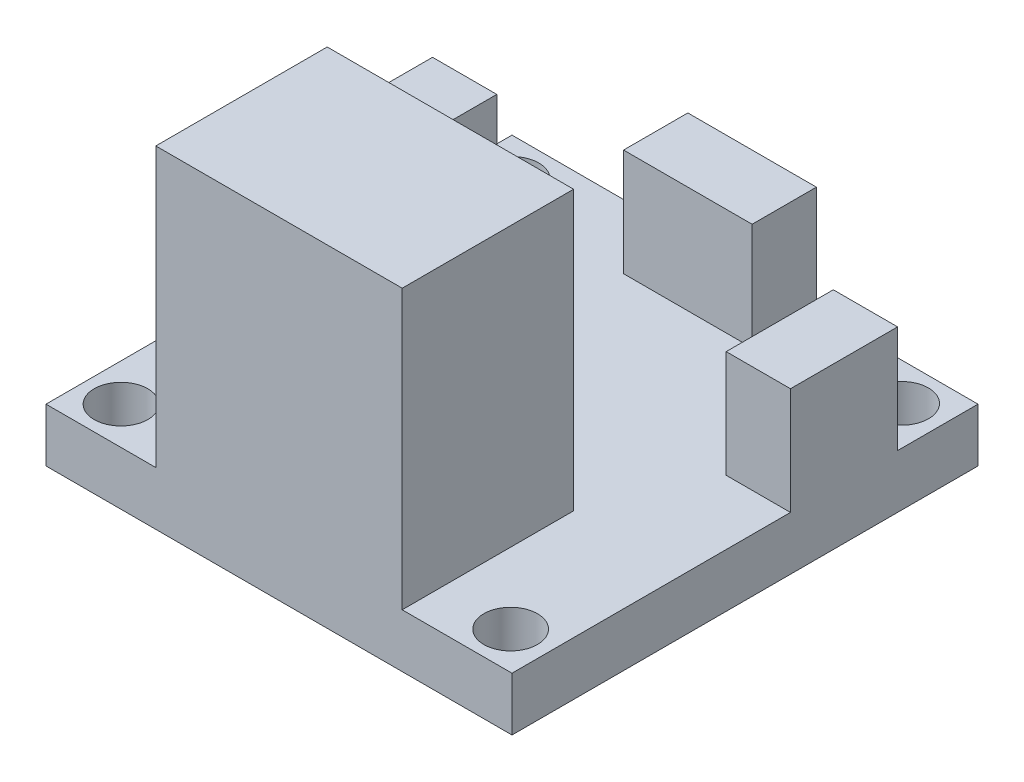
ISO-10303-21;
HEADER;
FILE_DESCRIPTION(('STEP AP214'),'2;1');
FILE_NAME('part.step','',(''),(''),'','','');
FILE_SCHEMA(('AUTOMOTIVE_DESIGN { 1 0 10303 214 1 1 1 1 }'));
ENDSEC;
DATA;
#1=APPLICATION_CONTEXT('core data for automotive mechanical design processes');
#2=APPLICATION_PROTOCOL_DEFINITION('international standard','automotive_design',2000,#1);
#3=PRODUCT_CONTEXT('',#1,'mechanical');
#4=PRODUCT('Part','Part','',(#3));
#5=PRODUCT_RELATED_PRODUCT_CATEGORY('part','',(#4));
#6=PRODUCT_DEFINITION_FORMATION('','',#4);
#7=PRODUCT_DEFINITION_CONTEXT('part definition',#1,'design');
#8=PRODUCT_DEFINITION('design','',#6,#7);
#9=PRODUCT_DEFINITION_SHAPE('','',#8);
#10=(LENGTH_UNIT() NAMED_UNIT(*) SI_UNIT(.MILLI.,.METRE.));
#11=(NAMED_UNIT(*) PLANE_ANGLE_UNIT() SI_UNIT($,.RADIAN.));
#12=(NAMED_UNIT(*) SI_UNIT($,.STERADIAN.) SOLID_ANGLE_UNIT());
#13=UNCERTAINTY_MEASURE_WITH_UNIT(LENGTH_MEASURE(1.E-05),#10,'distance_accuracy_value','');
#14=(GEOMETRIC_REPRESENTATION_CONTEXT(3) GLOBAL_UNCERTAINTY_ASSIGNED_CONTEXT((#13)) GLOBAL_UNIT_ASSIGNED_CONTEXT((#10,
#11,#12)) REPRESENTATION_CONTEXT('',''));
#15=CARTESIAN_POINT('',(0.,0.,0.));
#16=DIRECTION('',(0.,0.,1.));
#17=DIRECTION('',(1.,0.,0.));
#18=AXIS2_PLACEMENT_3D('',#15,#16,#17);
#19=CARTESIAN_POINT('',(0.,5.,0.));
#20=DIRECTION('',(0.,1.,0.));
#21=DIRECTION('',(0.,0.,1.));
#22=AXIS2_PLACEMENT_3D('',#19,#20,#21);
#23=PLANE('',#22);
#24=CARTESIAN_POINT('',(-18.25,5.,18.25));
#25=DIRECTION('',(0.,1.,0.));
#26=DIRECTION('',(0.,0.,1.));
#27=AXIS2_PLACEMENT_3D('',#24,#25,#26);
#28=CIRCLE('',#27,2.5);
#29=CARTESIAN_POINT('',(-18.25,5.,20.75));
#30=VERTEX_POINT('',#29);
#31=EDGE_CURVE('E377',#30,#30,#28,.T.);
#32=ORIENTED_EDGE('',*,*,#31,.F.);
#33=EDGE_LOOP('',(#32));
#34=FACE_BOUND('',#33,.T.);
#35=CARTESIAN_POINT('',(18.1240313628791,5.,18.25));
#36=DIRECTION('',(0.,1.,0.));
#37=DIRECTION('',(0.,0.,1.));
#38=AXIS2_PLACEMENT_3D('',#35,#36,#37);
#39=CIRCLE('',#38,2.5);
#40=CARTESIAN_POINT('',(18.1240313628791,5.,20.75));
#41=VERTEX_POINT('',#40);
#42=EDGE_CURVE('E371',#41,#41,#39,.T.);
#43=ORIENTED_EDGE('',*,*,#42,.F.);
#44=EDGE_LOOP('',(#43));
#45=FACE_BOUND('',#44,.T.);
#46=CARTESIAN_POINT('',(18.1240313628791,5.,-18.25));
#47=DIRECTION('',(0.,1.,0.));
#48=DIRECTION('',(0.,0.,1.));
#49=AXIS2_PLACEMENT_3D('',#46,#47,#48);
#50=CIRCLE('',#49,2.5);
#51=CARTESIAN_POINT('',(18.1240313628791,5.,-15.75));
#52=VERTEX_POINT('',#51);
#53=EDGE_CURVE('E365',#52,#52,#50,.T.);
#54=ORIENTED_EDGE('',*,*,#53,.F.);
#55=EDGE_LOOP('',(#54));
#56=FACE_BOUND('',#55,.T.);
#57=CARTESIAN_POINT('',(-18.25,5.,-18.25));
#58=DIRECTION('',(0.,1.,0.));
#59=DIRECTION('',(0.,0.,1.));
#60=AXIS2_PLACEMENT_3D('',#57,#58,#59);
#61=CIRCLE('',#60,2.5);
#62=CARTESIAN_POINT('',(-18.25,5.,-15.75));
#63=VERTEX_POINT('',#62);
#64=EDGE_CURVE('E359',#63,#63,#61,.T.);
#65=ORIENTED_EDGE('',*,*,#64,.F.);
#66=EDGE_LOOP('',(#65));
#67=FACE_BOUND('',#66,.T.);
#68=DIRECTION('',(0.,0.,1.));
#69=VECTOR('',#68,1.);
#70=CARTESIAN_POINT('',(15.75,5.,-14.2434558567143));
#71=LINE('',#70,#69);
#72=CARTESIAN_POINT('',(15.75,5.,-14.2434558567143));
#73=VERTEX_POINT('',#72);
#74=CARTESIAN_POINT('',(15.75,5.,-4.2434558567143));
#75=VERTEX_POINT('',#74);
#76=EDGE_CURVE('E51',#73,#75,#71,.T.);
#77=ORIENTED_EDGE('',*,*,#76,.F.);
#78=DIRECTION('',(-1.,0.,0.));
#79=VECTOR('',#78,1.);
#80=CARTESIAN_POINT('',(21.75,5.,-14.2434558567143));
#81=LINE('',#80,#79);
#82=CARTESIAN_POINT('',(21.75,5.,-14.2434558567143));
#83=VERTEX_POINT('',#82);
#84=EDGE_CURVE('E355',#83,#73,#81,.T.);
#85=ORIENTED_EDGE('',*,*,#84,.F.);
#86=DIRECTION('',(0.,0.,-1.));
#87=VECTOR('',#86,1.);
#88=CARTESIAN_POINT('',(21.75,5.,-21.75));
#89=LINE('',#88,#87);
#90=CARTESIAN_POINT('',(21.75,5.,-21.75));
#91=VERTEX_POINT('',#90);
#92=EDGE_CURVE('E194',#83,#91,#89,.T.);
#93=ORIENTED_EDGE('',*,*,#92,.T.);
#94=DIRECTION('',(-1.,0.,0.));
#95=VECTOR('',#94,1.);
#96=CARTESIAN_POINT('',(-21.75,5.,-21.75));
#97=LINE('',#96,#95);
#98=CARTESIAN_POINT('',(6.66419904438874,5.,-21.75));
#99=VERTEX_POINT('',#98);
#100=EDGE_CURVE('E280',#91,#99,#97,.T.);
#101=ORIENTED_EDGE('',*,*,#100,.T.);
#102=DIRECTION('',(0.,0.,-1.));
#103=VECTOR('',#102,1.);
#104=CARTESIAN_POINT('',(6.66419904438874,5.,-21.75));
#105=LINE('',#104,#103);
#106=CARTESIAN_POINT('',(6.66419904438874,5.,-15.75));
#107=VERTEX_POINT('',#106);
#108=EDGE_CURVE('E208',#107,#99,#105,.T.);
#109=ORIENTED_EDGE('',*,*,#108,.F.);
#110=DIRECTION('',(1.,0.,0.));
#111=VECTOR('',#110,1.);
#112=CARTESIAN_POINT('',(-5.33580095561126,5.,-15.75));
#113=LINE('',#112,#111);
#114=CARTESIAN_POINT('',(-5.33580095561126,5.,-15.75));
#115=VERTEX_POINT('',#114);
#116=EDGE_CURVE('E198',#115,#107,#113,.T.);
#117=ORIENTED_EDGE('',*,*,#116,.F.);
#118=DIRECTION('',(0.,0.,1.));
#119=VECTOR('',#118,1.);
#120=CARTESIAN_POINT('',(-5.33580095561126,5.,-21.75));
#121=LINE('',#120,#119);
#122=CARTESIAN_POINT('',(-5.33580095561126,5.,-21.75));
#123=VERTEX_POINT('',#122);
#124=EDGE_CURVE('E195',#123,#115,#121,.T.);
#125=ORIENTED_EDGE('',*,*,#124,.F.);
#126=CARTESIAN_POINT('',(-21.75,5.,-21.75));
#127=VERTEX_POINT('',#126);
#128=EDGE_CURVE('E279',#123,#127,#97,.T.);
#129=ORIENTED_EDGE('',*,*,#128,.T.);
#130=DIRECTION('',(0.,0.,1.));
#131=VECTOR('',#130,1.);
#132=CARTESIAN_POINT('',(-21.75,5.,-21.75));
#133=LINE('',#132,#131);
#134=CARTESIAN_POINT('',(-21.75,5.,-14.3316507072203));
#135=VERTEX_POINT('',#134);
#136=EDGE_CURVE('E283',#127,#135,#133,.T.);
#137=ORIENTED_EDGE('',*,*,#136,.T.);
#138=DIRECTION('',(-1.,0.,0.));
#139=VECTOR('',#138,1.);
#140=CARTESIAN_POINT('',(-21.75,5.,-14.3316507072203));
#141=LINE('',#140,#139);
#142=CARTESIAN_POINT('',(-15.75,5.,-14.3316507072203));
#143=VERTEX_POINT('',#142);
#144=EDGE_CURVE('E235',#143,#135,#141,.T.);
#145=ORIENTED_EDGE('',*,*,#144,.F.);
#146=DIRECTION('',(0.,0.,-1.));
#147=VECTOR('',#146,1.);
#148=CARTESIAN_POINT('',(-15.75,5.,-14.3316507072203));
#149=LINE('',#148,#147);
#150=CARTESIAN_POINT('',(-15.75,5.,-4.33165070722027));
#151=VERTEX_POINT('',#150);
#152=EDGE_CURVE('E243',#151,#143,#149,.T.);
#153=ORIENTED_EDGE('',*,*,#152,.F.);
#154=DIRECTION('',(1.,0.,0.));
#155=VECTOR('',#154,1.);
#156=CARTESIAN_POINT('',(-21.75,5.,-4.33165070722027));
#157=LINE('',#156,#155);
#158=CARTESIAN_POINT('',(-21.75,5.,-4.33165070722027));
#159=VERTEX_POINT('',#158);
#160=EDGE_CURVE('E230',#159,#151,#157,.T.);
#161=ORIENTED_EDGE('',*,*,#160,.F.);
#162=CARTESIAN_POINT('',(-21.75,5.,21.75));
#163=VERTEX_POINT('',#162);
#164=EDGE_CURVE('E282',#159,#163,#133,.T.);
#165=ORIENTED_EDGE('',*,*,#164,.T.);
#166=DIRECTION('',(1.,0.,0.));
#167=VECTOR('',#166,1.);
#168=CARTESIAN_POINT('',(-21.75,5.,21.75));
#169=LINE('',#168,#167);
#170=CARTESIAN_POINT('',(-11.5,5.,21.75));
#171=VERTEX_POINT('',#170);
#172=EDGE_CURVE('E295',#163,#171,#169,.T.);
#173=ORIENTED_EDGE('',*,*,#172,.T.);
#174=DIRECTION('',(0.,0.,1.));
#175=VECTOR('',#174,1.);
#176=CARTESIAN_POINT('',(-11.5,5.,21.75));
#177=LINE('',#176,#175);
#178=CARTESIAN_POINT('',(-11.5,5.,5.75));
#179=VERTEX_POINT('',#178);
#180=EDGE_CURVE('E37',#179,#171,#177,.T.);
#181=ORIENTED_EDGE('',*,*,#180,.F.);
#182=DIRECTION('',(-1.,0.,0.));
#183=VECTOR('',#182,1.);
#184=CARTESIAN_POINT('',(-11.5,5.,5.75));
#185=LINE('',#184,#183);
#186=CARTESIAN_POINT('',(11.5,5.,5.75));
#187=VERTEX_POINT('',#186);
#188=EDGE_CURVE('E260',#187,#179,#185,.T.);
#189=ORIENTED_EDGE('',*,*,#188,.F.);
#190=DIRECTION('',(0.,0.,-1.));
#191=VECTOR('',#190,1.);
#192=CARTESIAN_POINT('',(11.5,5.,21.75));
#193=LINE('',#192,#191);
#194=CARTESIAN_POINT('',(11.5,5.,21.75));
#195=VERTEX_POINT('',#194);
#196=EDGE_CURVE('E270',#195,#187,#193,.T.);
#197=ORIENTED_EDGE('',*,*,#196,.F.);
#198=CARTESIAN_POINT('',(21.75,5.,21.75));
#199=VERTEX_POINT('',#198);
#200=EDGE_CURVE('E286',#195,#199,#169,.T.);
#201=ORIENTED_EDGE('',*,*,#200,.T.);
#202=CARTESIAN_POINT('',(21.75,5.,-4.2434558567143));
#203=VERTEX_POINT('',#202);
#204=EDGE_CURVE('E277',#199,#203,#89,.T.);
#205=ORIENTED_EDGE('',*,*,#204,.T.);
#206=DIRECTION('',(1.,0.,0.));
#207=VECTOR('',#206,1.);
#208=CARTESIAN_POINT('',(21.75,5.,-4.2434558567143));
#209=LINE('',#208,#207);
#210=EDGE_CURVE('E56',#75,#203,#209,.T.);
#211=ORIENTED_EDGE('',*,*,#210,.F.);
#212=EDGE_LOOP('',(#77,#85,#93,#101,#109,#117,#125,#129,#137,#145,#153,#161,#165,#173,#181,#189,
#197,#201,#205,#211));
#213=FACE_BOUND('',#212,.T.);
#214=ADVANCED_FACE('F33',(#34,#45,#56,#67,#213),#23,.T.);
#215=CARTESIAN_POINT('',(21.75,5.,-21.75));
#216=DIRECTION('',(-1.,0.,0.));
#217=DIRECTION('',(0.,0.,1.));
#218=AXIS2_PLACEMENT_3D('',#215,#216,#217);
#219=PLANE('',#218);
#220=DIRECTION('',(0.,0.,-1.));
#221=VECTOR('',#220,1.);
#222=CARTESIAN_POINT('',(21.75,0.,-21.75));
#223=LINE('',#222,#221);
#224=CARTESIAN_POINT('',(21.75,0.,21.75));
#225=VERTEX_POINT('',#224);
#226=CARTESIAN_POINT('',(21.75,0.,-21.75));
#227=VERTEX_POINT('',#226);
#228=EDGE_CURVE('E289',#225,#227,#223,.T.);
#229=ORIENTED_EDGE('',*,*,#228,.T.);
#230=DIRECTION('',(0.,-1.,0.));
#231=VECTOR('',#230,1.);
#232=CARTESIAN_POINT('',(21.75,5.,-21.75));
#233=LINE('',#232,#231);
#234=EDGE_CURVE('E11',#91,#227,#233,.T.);
#235=ORIENTED_EDGE('',*,*,#234,.F.);
#236=ORIENTED_EDGE('',*,*,#92,.F.);
#237=DIRECTION('',(0.,-1.,0.));
#238=VECTOR('',#237,1.);
#239=CARTESIAN_POINT('',(21.75,15.,-14.2434558567143));
#240=LINE('',#239,#238);
#241=CARTESIAN_POINT('',(21.75,15.,-14.2434558567143));
#242=VERTEX_POINT('',#241);
#243=EDGE_CURVE('E176',#242,#83,#240,.T.);
#244=ORIENTED_EDGE('',*,*,#243,.F.);
#245=DIRECTION('',(0.,0.,-1.));
#246=VECTOR('',#245,1.);
#247=CARTESIAN_POINT('',(21.75,15.,-14.2434558567143));
#248=LINE('',#247,#246);
#249=CARTESIAN_POINT('',(21.75,15.,-4.2434558567143));
#250=VERTEX_POINT('',#249);
#251=EDGE_CURVE('E182',#250,#242,#248,.T.);
#252=ORIENTED_EDGE('',*,*,#251,.F.);
#253=DIRECTION('',(0.,-1.,0.));
#254=VECTOR('',#253,1.);
#255=CARTESIAN_POINT('',(21.75,15.,-4.2434558567143));
#256=LINE('',#255,#254);
#257=EDGE_CURVE('E348',#250,#203,#256,.T.);
#258=ORIENTED_EDGE('',*,*,#257,.T.);
#259=ORIENTED_EDGE('',*,*,#204,.F.);
#260=DIRECTION('',(0.,-1.,0.));
#261=VECTOR('',#260,1.);
#262=CARTESIAN_POINT('',(21.75,5.,21.75));
#263=LINE('',#262,#261);
#264=EDGE_CURVE('E296',#199,#225,#263,.T.);
#265=ORIENTED_EDGE('',*,*,#264,.T.);
#266=EDGE_LOOP('',(#229,#235,#236,#244,#252,#258,#259,#265));
#267=FACE_BOUND('',#266,.T.);
#268=ADVANCED_FACE('F35',(#267),#219,.F.);
#269=CARTESIAN_POINT('',(-21.75,5.,-21.75));
#270=DIRECTION('',(0.,0.,1.));
#271=DIRECTION('',(1.,0.,0.));
#272=AXIS2_PLACEMENT_3D('',#269,#270,#271);
#273=PLANE('',#272);
#274=DIRECTION('',(-1.,0.,0.));
#275=VECTOR('',#274,1.);
#276=CARTESIAN_POINT('',(-21.75,0.,-21.75));
#277=LINE('',#276,#275);
#278=CARTESIAN_POINT('',(-21.75,0.,-21.75));
#279=VERTEX_POINT('',#278);
#280=EDGE_CURVE('E308',#227,#279,#277,.T.);
#281=ORIENTED_EDGE('',*,*,#280,.T.);
#282=DIRECTION('',(0.,-1.,0.));
#283=VECTOR('',#282,1.);
#284=CARTESIAN_POINT('',(-21.75,5.,-21.75));
#285=LINE('',#284,#283);
#286=EDGE_CURVE('E43',#127,#279,#285,.T.);
#287=ORIENTED_EDGE('',*,*,#286,.F.);
#288=ORIENTED_EDGE('',*,*,#128,.F.);
#289=DIRECTION('',(0.,-1.,0.));
#290=VECTOR('',#289,1.);
#291=CARTESIAN_POINT('',(-5.33580095561126,15.,-21.75));
#292=LINE('',#291,#290);
#293=CARTESIAN_POINT('',(-5.33580095561126,15.,-21.75));
#294=VERTEX_POINT('',#293);
#295=EDGE_CURVE('E213',#294,#123,#292,.T.);
#296=ORIENTED_EDGE('',*,*,#295,.F.);
#297=DIRECTION('',(-1.,0.,0.));
#298=VECTOR('',#297,1.);
#299=CARTESIAN_POINT('',(-5.33580095561126,15.,-21.75));
#300=LINE('',#299,#298);
#301=CARTESIAN_POINT('',(6.66419904438874,15.,-21.75));
#302=VERTEX_POINT('',#301);
#303=EDGE_CURVE('E212',#302,#294,#300,.T.);
#304=ORIENTED_EDGE('',*,*,#303,.F.);
#305=DIRECTION('',(0.,-1.,0.));
#306=VECTOR('',#305,1.);
#307=CARTESIAN_POINT('',(6.66419904438874,15.,-21.75));
#308=LINE('',#307,#306);
#309=EDGE_CURVE('E221',#302,#99,#308,.T.);
#310=ORIENTED_EDGE('',*,*,#309,.T.);
#311=ORIENTED_EDGE('',*,*,#100,.F.);
#312=ORIENTED_EDGE('',*,*,#234,.T.);
#313=EDGE_LOOP('',(#281,#287,#288,#296,#304,#310,#311,#312));
#314=FACE_BOUND('',#313,.T.);
#315=ADVANCED_FACE('F471',(#314),#273,.F.);
#316=CARTESIAN_POINT('',(-21.75,5.,-21.75));
#317=DIRECTION('',(1.,0.,0.));
#318=DIRECTION('',(0.,0.,-1.));
#319=AXIS2_PLACEMENT_3D('',#316,#317,#318);
#320=PLANE('',#319);
#321=DIRECTION('',(0.,0.,1.));
#322=VECTOR('',#321,1.);
#323=CARTESIAN_POINT('',(-21.75,0.,-21.75));
#324=LINE('',#323,#322);
#325=CARTESIAN_POINT('',(-21.75,0.,21.75));
#326=VERTEX_POINT('',#325);
#327=EDGE_CURVE('E307',#279,#326,#324,.T.);
#328=ORIENTED_EDGE('',*,*,#327,.T.);
#329=DIRECTION('',(0.,-1.,0.));
#330=VECTOR('',#329,1.);
#331=CARTESIAN_POINT('',(-21.75,5.,21.75));
#332=LINE('',#331,#330);
#333=EDGE_CURVE('E300',#163,#326,#332,.T.);
#334=ORIENTED_EDGE('',*,*,#333,.F.);
#335=ORIENTED_EDGE('',*,*,#164,.F.);
#336=DIRECTION('',(0.,-1.,0.));
#337=VECTOR('',#336,1.);
#338=CARTESIAN_POINT('',(-21.75,15.,-4.33165070722027));
#339=LINE('',#338,#337);
#340=CARTESIAN_POINT('',(-21.75,15.,-4.33165070722027));
#341=VERTEX_POINT('',#340);
#342=EDGE_CURVE('E254',#341,#159,#339,.T.);
#343=ORIENTED_EDGE('',*,*,#342,.F.);
#344=DIRECTION('',(0.,0.,1.));
#345=VECTOR('',#344,1.);
#346=CARTESIAN_POINT('',(-21.75,15.,-14.3316507072203));
#347=LINE('',#346,#345);
#348=CARTESIAN_POINT('',(-21.75,15.,-14.3316507072203));
#349=VERTEX_POINT('',#348);
#350=EDGE_CURVE('E231',#349,#341,#347,.T.);
#351=ORIENTED_EDGE('',*,*,#350,.F.);
#352=DIRECTION('',(0.,-1.,0.));
#353=VECTOR('',#352,1.);
#354=CARTESIAN_POINT('',(-21.75,15.,-14.3316507072203));
#355=LINE('',#354,#353);
#356=EDGE_CURVE('E241',#349,#135,#355,.T.);
#357=ORIENTED_EDGE('',*,*,#356,.T.);
#358=ORIENTED_EDGE('',*,*,#136,.F.);
#359=ORIENTED_EDGE('',*,*,#286,.T.);
#360=EDGE_LOOP('',(#328,#334,#335,#343,#351,#357,#358,#359));
#361=FACE_BOUND('',#360,.T.);
#362=ADVANCED_FACE('F469',(#361),#320,.F.);
#363=CARTESIAN_POINT('',(-21.75,5.,21.75));
#364=DIRECTION('',(0.,0.,-1.));
#365=DIRECTION('',(-1.,0.,0.));
#366=AXIS2_PLACEMENT_3D('',#363,#364,#365);
#367=PLANE('',#366);
#368=DIRECTION('',(1.,0.,0.));
#369=VECTOR('',#368,1.);
#370=CARTESIAN_POINT('',(-21.75,0.,21.75));
#371=LINE('',#370,#369);
#372=EDGE_CURVE('E305',#326,#225,#371,.T.);
#373=ORIENTED_EDGE('',*,*,#372,.T.);
#374=ORIENTED_EDGE('',*,*,#264,.F.);
#375=ORIENTED_EDGE('',*,*,#200,.F.);
#376=DIRECTION('',(0.,-1.,0.));
#377=VECTOR('',#376,1.);
#378=CARTESIAN_POINT('',(11.5,31.,21.75));
#379=LINE('',#378,#377);
#380=CARTESIAN_POINT('',(11.5,31.,21.75));
#381=VERTEX_POINT('',#380);
#382=EDGE_CURVE('E276',#381,#195,#379,.T.);
#383=ORIENTED_EDGE('',*,*,#382,.F.);
#384=DIRECTION('',(1.,0.,0.));
#385=VECTOR('',#384,1.);
#386=CARTESIAN_POINT('',(-11.5,31.,21.75));
#387=LINE('',#386,#385);
#388=CARTESIAN_POINT('',(-11.5,31.,21.75));
#389=VERTEX_POINT('',#388);
#390=EDGE_CURVE('E259',#389,#381,#387,.T.);
#391=ORIENTED_EDGE('',*,*,#390,.F.);
#392=DIRECTION('',(0.,-1.,0.));
#393=VECTOR('',#392,1.);
#394=CARTESIAN_POINT('',(-11.5,31.,21.75));
#395=LINE('',#394,#393);
#396=EDGE_CURVE('E311',#389,#171,#395,.T.);
#397=ORIENTED_EDGE('',*,*,#396,.T.);
#398=ORIENTED_EDGE('',*,*,#172,.F.);
#399=ORIENTED_EDGE('',*,*,#333,.T.);
#400=EDGE_LOOP('',(#373,#374,#375,#383,#391,#397,#398,#399));
#401=FACE_BOUND('',#400,.T.);
#402=ADVANCED_FACE('F342',(#401),#367,.F.);
#403=CARTESIAN_POINT('',(0.,0.,0.));
#404=DIRECTION('',(0.,1.,0.));
#405=DIRECTION('',(0.,0.,1.));
#406=AXIS2_PLACEMENT_3D('',#403,#404,#405);
#407=PLANE('',#406);
#408=CARTESIAN_POINT('',(-18.25,0.,18.25));
#409=DIRECTION('',(0.,1.,0.));
#410=DIRECTION('',(0.,0.,1.));
#411=AXIS2_PLACEMENT_3D('',#408,#409,#410);
#412=CIRCLE('',#411,2.5);
#413=CARTESIAN_POINT('',(-18.25,0.,20.75));
#414=VERTEX_POINT('',#413);
#415=EDGE_CURVE('E374',#414,#414,#412,.T.);
#416=ORIENTED_EDGE('',*,*,#415,.T.);
#417=EDGE_LOOP('',(#416));
#418=FACE_BOUND('',#417,.T.);
#419=CARTESIAN_POINT('',(18.1240313628791,0.,18.25));
#420=DIRECTION('',(0.,1.,0.));
#421=DIRECTION('',(0.,0.,1.));
#422=AXIS2_PLACEMENT_3D('',#419,#420,#421);
#423=CIRCLE('',#422,2.5);
#424=CARTESIAN_POINT('',(18.1240313628791,0.,20.75));
#425=VERTEX_POINT('',#424);
#426=EDGE_CURVE('E368',#425,#425,#423,.T.);
#427=ORIENTED_EDGE('',*,*,#426,.T.);
#428=EDGE_LOOP('',(#427));
#429=FACE_BOUND('',#428,.T.);
#430=CARTESIAN_POINT('',(18.1240313628791,0.,-18.25));
#431=DIRECTION('',(0.,1.,0.));
#432=DIRECTION('',(0.,0.,1.));
#433=AXIS2_PLACEMENT_3D('',#430,#431,#432);
#434=CIRCLE('',#433,2.5);
#435=CARTESIAN_POINT('',(18.1240313628791,0.,-15.75));
#436=VERTEX_POINT('',#435);
#437=EDGE_CURVE('E362',#436,#436,#434,.T.);
#438=ORIENTED_EDGE('',*,*,#437,.T.);
#439=EDGE_LOOP('',(#438));
#440=FACE_BOUND('',#439,.T.);
#441=CARTESIAN_POINT('',(-18.25,0.,-18.25));
#442=DIRECTION('',(0.,1.,0.));
#443=DIRECTION('',(0.,0.,1.));
#444=AXIS2_PLACEMENT_3D('',#441,#442,#443);
#445=CIRCLE('',#444,2.5);
#446=CARTESIAN_POINT('',(-18.25,0.,-15.75));
#447=VERTEX_POINT('',#446);
#448=EDGE_CURVE('E356',#447,#447,#445,.T.);
#449=ORIENTED_EDGE('',*,*,#448,.T.);
#450=EDGE_LOOP('',(#449));
#451=FACE_BOUND('',#450,.T.);
#452=ORIENTED_EDGE('',*,*,#228,.F.);
#453=ORIENTED_EDGE('',*,*,#372,.F.);
#454=ORIENTED_EDGE('',*,*,#327,.F.);
#455=ORIENTED_EDGE('',*,*,#280,.F.);
#456=EDGE_LOOP('',(#452,#453,#454,#455));
#457=FACE_BOUND('',#456,.T.);
#458=ADVANCED_FACE('F383',(#418,#429,#440,#451,#457),#407,.F.);
#459=CARTESIAN_POINT('',(-11.5,31.,21.75));
#460=DIRECTION('',(1.,0.,0.));
#461=DIRECTION('',(0.,0.,-1.));
#462=AXIS2_PLACEMENT_3D('',#459,#460,#461);
#463=PLANE('',#462);
#464=ORIENTED_EDGE('',*,*,#180,.T.);
#465=ORIENTED_EDGE('',*,*,#396,.F.);
#466=DIRECTION('',(0.,0.,1.));
#467=VECTOR('',#466,1.);
#468=CARTESIAN_POINT('',(-11.5,31.,21.75));
#469=LINE('',#468,#467);
#470=CARTESIAN_POINT('',(-11.5,31.,5.75));
#471=VERTEX_POINT('',#470);
#472=EDGE_CURVE('E256',#471,#389,#469,.T.);
#473=ORIENTED_EDGE('',*,*,#472,.F.);
#474=DIRECTION('',(0.,-1.,0.));
#475=VECTOR('',#474,1.);
#476=CARTESIAN_POINT('',(-11.5,31.,5.75));
#477=LINE('',#476,#475);
#478=EDGE_CURVE('E265',#471,#179,#477,.T.);
#479=ORIENTED_EDGE('',*,*,#478,.T.);
#480=EDGE_LOOP('',(#464,#465,#473,#479));
#481=FACE_BOUND('',#480,.T.);
#482=ADVANCED_FACE('F330',(#481),#463,.F.);
#483=CARTESIAN_POINT('',(11.5,31.,21.75));
#484=DIRECTION('',(-1.,0.,0.));
#485=DIRECTION('',(0.,0.,1.));
#486=AXIS2_PLACEMENT_3D('',#483,#484,#485);
#487=PLANE('',#486);
#488=ORIENTED_EDGE('',*,*,#196,.T.);
#489=DIRECTION('',(0.,-1.,0.));
#490=VECTOR('',#489,1.);
#491=CARTESIAN_POINT('',(11.5,31.,5.75));
#492=LINE('',#491,#490);
#493=CARTESIAN_POINT('',(11.5,31.,5.75));
#494=VERTEX_POINT('',#493);
#495=EDGE_CURVE('E273',#494,#187,#492,.T.);
#496=ORIENTED_EDGE('',*,*,#495,.F.);
#497=DIRECTION('',(0.,0.,-1.));
#498=VECTOR('',#497,1.);
#499=CARTESIAN_POINT('',(11.5,31.,21.75));
#500=LINE('',#499,#498);
#501=EDGE_CURVE('E262',#381,#494,#500,.T.);
#502=ORIENTED_EDGE('',*,*,#501,.F.);
#503=ORIENTED_EDGE('',*,*,#382,.T.);
#504=EDGE_LOOP('',(#488,#496,#502,#503));
#505=FACE_BOUND('',#504,.T.);
#506=ADVANCED_FACE('F337',(#505),#487,.F.);
#507=CARTESIAN_POINT('',(-11.5,31.,5.75));
#508=DIRECTION('',(0.,0.,1.));
#509=DIRECTION('',(1.,0.,0.));
#510=AXIS2_PLACEMENT_3D('',#507,#508,#509);
#511=PLANE('',#510);
#512=ORIENTED_EDGE('',*,*,#188,.T.);
#513=ORIENTED_EDGE('',*,*,#478,.F.);
#514=DIRECTION('',(-1.,0.,0.));
#515=VECTOR('',#514,1.);
#516=CARTESIAN_POINT('',(-11.5,31.,5.75));
#517=LINE('',#516,#515);
#518=EDGE_CURVE('E264',#494,#471,#517,.T.);
#519=ORIENTED_EDGE('',*,*,#518,.F.);
#520=ORIENTED_EDGE('',*,*,#495,.T.);
#521=EDGE_LOOP('',(#512,#513,#519,#520));
#522=FACE_BOUND('',#521,.T.);
#523=ADVANCED_FACE('F334',(#522),#511,.F.);
#524=CARTESIAN_POINT('',(0.,31.,0.));
#525=DIRECTION('',(0.,-1.,0.));
#526=DIRECTION('',(0.,0.,-1.));
#527=AXIS2_PLACEMENT_3D('',#524,#525,#526);
#528=PLANE('',#527);
#529=ORIENTED_EDGE('',*,*,#472,.T.);
#530=ORIENTED_EDGE('',*,*,#390,.T.);
#531=ORIENTED_EDGE('',*,*,#501,.T.);
#532=ORIENTED_EDGE('',*,*,#518,.T.);
#533=EDGE_LOOP('',(#529,#530,#531,#532));
#534=FACE_BOUND('',#533,.T.);
#535=ADVANCED_FACE('F340',(#534),#528,.F.);
#536=CARTESIAN_POINT('',(-21.75,15.,-4.33165070722027));
#537=DIRECTION('',(0.,0.,-1.));
#538=DIRECTION('',(-1.,0.,0.));
#539=AXIS2_PLACEMENT_3D('',#536,#537,#538);
#540=PLANE('',#539);
#541=ORIENTED_EDGE('',*,*,#160,.T.);
#542=DIRECTION('',(0.,-1.,0.));
#543=VECTOR('',#542,1.);
#544=CARTESIAN_POINT('',(-15.75,15.,-4.33165070722027));
#545=LINE('',#544,#543);
#546=CARTESIAN_POINT('',(-15.75,15.,-4.33165070722027));
#547=VERTEX_POINT('',#546);
#548=EDGE_CURVE('E251',#547,#151,#545,.T.);
#549=ORIENTED_EDGE('',*,*,#548,.F.);
#550=DIRECTION('',(1.,0.,0.));
#551=VECTOR('',#550,1.);
#552=CARTESIAN_POINT('',(-21.75,15.,-4.33165070722027));
#553=LINE('',#552,#551);
#554=EDGE_CURVE('E234',#341,#547,#553,.T.);
#555=ORIENTED_EDGE('',*,*,#554,.F.);
#556=ORIENTED_EDGE('',*,*,#342,.T.);
#557=EDGE_LOOP('',(#541,#549,#555,#556));
#558=FACE_BOUND('',#557,.T.);
#559=ADVANCED_FACE('F452',(#558),#540,.F.);
#560=CARTESIAN_POINT('',(-15.75,15.,-14.3316507072203));
#561=DIRECTION('',(-1.,0.,0.));
#562=DIRECTION('',(0.,0.,1.));
#563=AXIS2_PLACEMENT_3D('',#560,#561,#562);
#564=PLANE('',#563);
#565=ORIENTED_EDGE('',*,*,#152,.T.);
#566=DIRECTION('',(0.,-1.,0.));
#567=VECTOR('',#566,1.);
#568=CARTESIAN_POINT('',(-15.75,15.,-14.3316507072203));
#569=LINE('',#568,#567);
#570=CARTESIAN_POINT('',(-15.75,15.,-14.3316507072203));
#571=VERTEX_POINT('',#570);
#572=EDGE_CURVE('E249',#571,#143,#569,.T.);
#573=ORIENTED_EDGE('',*,*,#572,.F.);
#574=DIRECTION('',(0.,0.,-1.));
#575=VECTOR('',#574,1.);
#576=CARTESIAN_POINT('',(-15.75,15.,-14.3316507072203));
#577=LINE('',#576,#575);
#578=EDGE_CURVE('E237',#547,#571,#577,.T.);
#579=ORIENTED_EDGE('',*,*,#578,.F.);
#580=ORIENTED_EDGE('',*,*,#548,.T.);
#581=EDGE_LOOP('',(#565,#573,#579,#580));
#582=FACE_BOUND('',#581,.T.);
#583=ADVANCED_FACE('F448',(#582),#564,.F.);
#584=CARTESIAN_POINT('',(-21.75,15.,-14.3316507072203));
#585=DIRECTION('',(0.,0.,1.));
#586=DIRECTION('',(1.,0.,0.));
#587=AXIS2_PLACEMENT_3D('',#584,#585,#586);
#588=PLANE('',#587);
#589=ORIENTED_EDGE('',*,*,#144,.T.);
#590=ORIENTED_EDGE('',*,*,#356,.F.);
#591=DIRECTION('',(-1.,0.,0.));
#592=VECTOR('',#591,1.);
#593=CARTESIAN_POINT('',(-21.75,15.,-14.3316507072203));
#594=LINE('',#593,#592);
#595=EDGE_CURVE('E239',#571,#349,#594,.T.);
#596=ORIENTED_EDGE('',*,*,#595,.F.);
#597=ORIENTED_EDGE('',*,*,#572,.T.);
#598=EDGE_LOOP('',(#589,#590,#596,#597));
#599=FACE_BOUND('',#598,.T.);
#600=ADVANCED_FACE('F444',(#599),#588,.F.);
#601=CARTESIAN_POINT('',(0.,15.,0.));
#602=DIRECTION('',(0.,1.,0.));
#603=DIRECTION('',(0.,0.,1.));
#604=AXIS2_PLACEMENT_3D('',#601,#602,#603);
#605=PLANE('',#604);
#606=ORIENTED_EDGE('',*,*,#350,.T.);
#607=ORIENTED_EDGE('',*,*,#554,.T.);
#608=ORIENTED_EDGE('',*,*,#578,.T.);
#609=ORIENTED_EDGE('',*,*,#595,.T.);
#610=EDGE_LOOP('',(#606,#607,#608,#609));
#611=FACE_BOUND('',#610,.T.);
#612=ADVANCED_FACE('F440',(#611),#605,.T.);
#613=CARTESIAN_POINT('',(-5.33580095561126,15.,-21.75));
#614=DIRECTION('',(1.,0.,0.));
#615=DIRECTION('',(0.,0.,-1.));
#616=AXIS2_PLACEMENT_3D('',#613,#614,#615);
#617=PLANE('',#616);
#618=ORIENTED_EDGE('',*,*,#124,.T.);
#619=DIRECTION('',(0.,-1.,0.));
#620=VECTOR('',#619,1.);
#621=CARTESIAN_POINT('',(-5.33580095561126,15.,-15.75));
#622=LINE('',#621,#620);
#623=CARTESIAN_POINT('',(-5.33580095561126,15.,-15.75));
#624=VERTEX_POINT('',#623);
#625=EDGE_CURVE('E227',#624,#115,#622,.T.);
#626=ORIENTED_EDGE('',*,*,#625,.F.);
#627=DIRECTION('',(0.,0.,1.));
#628=VECTOR('',#627,1.);
#629=CARTESIAN_POINT('',(-5.33580095561126,15.,-21.75));
#630=LINE('',#629,#628);
#631=EDGE_CURVE('E204',#294,#624,#630,.T.);
#632=ORIENTED_EDGE('',*,*,#631,.F.);
#633=ORIENTED_EDGE('',*,*,#295,.T.);
#634=EDGE_LOOP('',(#618,#626,#632,#633));
#635=FACE_BOUND('',#634,.T.);
#636=ADVANCED_FACE('F436',(#635),#617,.F.);
#637=CARTESIAN_POINT('',(-5.33580095561126,15.,-15.75));
#638=DIRECTION('',(0.,0.,-1.));
#639=DIRECTION('',(-1.,0.,0.));
#640=AXIS2_PLACEMENT_3D('',#637,#638,#639);
#641=PLANE('',#640);
#642=ORIENTED_EDGE('',*,*,#116,.T.);
#643=DIRECTION('',(0.,-1.,0.));
#644=VECTOR('',#643,1.);
#645=CARTESIAN_POINT('',(6.66419904438874,15.,-15.75));
#646=LINE('',#645,#644);
#647=CARTESIAN_POINT('',(6.66419904438874,15.,-15.75));
#648=VERTEX_POINT('',#647);
#649=EDGE_CURVE('E224',#648,#107,#646,.T.);
#650=ORIENTED_EDGE('',*,*,#649,.F.);
#651=DIRECTION('',(1.,0.,0.));
#652=VECTOR('',#651,1.);
#653=CARTESIAN_POINT('',(-5.33580095561126,15.,-15.75));
#654=LINE('',#653,#652);
#655=EDGE_CURVE('E207',#624,#648,#654,.T.);
#656=ORIENTED_EDGE('',*,*,#655,.F.);
#657=ORIENTED_EDGE('',*,*,#625,.T.);
#658=EDGE_LOOP('',(#642,#650,#656,#657));
#659=FACE_BOUND('',#658,.T.);
#660=ADVANCED_FACE('F432',(#659),#641,.F.);
#661=CARTESIAN_POINT('',(6.66419904438874,15.,-21.75));
#662=DIRECTION('',(-1.,0.,0.));
#663=DIRECTION('',(0.,0.,1.));
#664=AXIS2_PLACEMENT_3D('',#661,#662,#663);
#665=PLANE('',#664);
#666=ORIENTED_EDGE('',*,*,#108,.T.);
#667=ORIENTED_EDGE('',*,*,#309,.F.);
#668=DIRECTION('',(0.,0.,-1.));
#669=VECTOR('',#668,1.);
#670=CARTESIAN_POINT('',(6.66419904438874,15.,-21.75));
#671=LINE('',#670,#669);
#672=EDGE_CURVE('E210',#648,#302,#671,.T.);
#673=ORIENTED_EDGE('',*,*,#672,.F.);
#674=ORIENTED_EDGE('',*,*,#649,.T.);
#675=EDGE_LOOP('',(#666,#667,#673,#674));
#676=FACE_BOUND('',#675,.T.);
#677=ADVANCED_FACE('F428',(#676),#665,.F.);
#678=CARTESIAN_POINT('',(0.,15.,0.));
#679=DIRECTION('',(0.,1.,0.));
#680=DIRECTION('',(0.,0.,1.));
#681=AXIS2_PLACEMENT_3D('',#678,#679,#680);
#682=PLANE('',#681);
#683=ORIENTED_EDGE('',*,*,#631,.T.);
#684=ORIENTED_EDGE('',*,*,#655,.T.);
#685=ORIENTED_EDGE('',*,*,#672,.T.);
#686=ORIENTED_EDGE('',*,*,#303,.T.);
#687=EDGE_LOOP('',(#683,#684,#685,#686));
#688=FACE_BOUND('',#687,.T.);
#689=ADVANCED_FACE('F425',(#688),#682,.T.);
#690=CARTESIAN_POINT('',(21.75,15.,-14.2434558567143));
#691=DIRECTION('',(0.,0.,1.));
#692=DIRECTION('',(1.,0.,0.));
#693=AXIS2_PLACEMENT_3D('',#690,#691,#692);
#694=PLANE('',#693);
#695=ORIENTED_EDGE('',*,*,#84,.T.);
#696=DIRECTION('',(0.,-1.,0.));
#697=VECTOR('',#696,1.);
#698=CARTESIAN_POINT('',(15.75,15.,-14.2434558567143));
#699=LINE('',#698,#697);
#700=CARTESIAN_POINT('',(15.75,15.,-14.2434558567143));
#701=VERTEX_POINT('',#700);
#702=EDGE_CURVE('E178',#701,#73,#699,.T.);
#703=ORIENTED_EDGE('',*,*,#702,.F.);
#704=DIRECTION('',(-1.,0.,0.));
#705=VECTOR('',#704,1.);
#706=CARTESIAN_POINT('',(21.75,15.,-14.2434558567143));
#707=LINE('',#706,#705);
#708=EDGE_CURVE('E172',#242,#701,#707,.T.);
#709=ORIENTED_EDGE('',*,*,#708,.F.);
#710=ORIENTED_EDGE('',*,*,#243,.T.);
#711=EDGE_LOOP('',(#695,#703,#709,#710));
#712=FACE_BOUND('',#711,.T.);
#713=ADVANCED_FACE('F174',(#712),#694,.F.);
#714=CARTESIAN_POINT('',(15.75,15.,-14.2434558567143));
#715=DIRECTION('',(1.,0.,0.));
#716=DIRECTION('',(0.,0.,-1.));
#717=AXIS2_PLACEMENT_3D('',#714,#715,#716);
#718=PLANE('',#717);
#719=ORIENTED_EDGE('',*,*,#76,.T.);
#720=DIRECTION('',(0.,-1.,0.));
#721=VECTOR('',#720,1.);
#722=CARTESIAN_POINT('',(15.75,15.,-4.2434558567143));
#723=LINE('',#722,#721);
#724=CARTESIAN_POINT('',(15.75,15.,-4.2434558567143));
#725=VERTEX_POINT('',#724);
#726=EDGE_CURVE('E200',#725,#75,#723,.T.);
#727=ORIENTED_EDGE('',*,*,#726,.F.);
#728=DIRECTION('',(0.,0.,1.));
#729=VECTOR('',#728,1.);
#730=CARTESIAN_POINT('',(15.75,15.,-14.2434558567143));
#731=LINE('',#730,#729);
#732=EDGE_CURVE('E181',#701,#725,#731,.T.);
#733=ORIENTED_EDGE('',*,*,#732,.F.);
#734=ORIENTED_EDGE('',*,*,#702,.T.);
#735=EDGE_LOOP('',(#719,#727,#733,#734));
#736=FACE_BOUND('',#735,.T.);
#737=ADVANCED_FACE('F419',(#736),#718,.F.);
#738=CARTESIAN_POINT('',(21.75,15.,-4.2434558567143));
#739=DIRECTION('',(0.,0.,-1.));
#740=DIRECTION('',(-1.,0.,0.));
#741=AXIS2_PLACEMENT_3D('',#738,#739,#740);
#742=PLANE('',#741);
#743=ORIENTED_EDGE('',*,*,#210,.T.);
#744=ORIENTED_EDGE('',*,*,#257,.F.);
#745=DIRECTION('',(1.,0.,0.));
#746=VECTOR('',#745,1.);
#747=CARTESIAN_POINT('',(21.75,15.,-4.2434558567143));
#748=LINE('',#747,#746);
#749=EDGE_CURVE('E187',#725,#250,#748,.T.);
#750=ORIENTED_EDGE('',*,*,#749,.F.);
#751=ORIENTED_EDGE('',*,*,#726,.T.);
#752=EDGE_LOOP('',(#743,#744,#750,#751));
#753=FACE_BOUND('',#752,.T.);
#754=ADVANCED_FACE('F347',(#753),#742,.F.);
#755=CARTESIAN_POINT('',(0.,15.,0.));
#756=DIRECTION('',(0.,-1.,0.));
#757=DIRECTION('',(0.,0.,-1.));
#758=AXIS2_PLACEMENT_3D('',#755,#756,#757);
#759=PLANE('',#758);
#760=ORIENTED_EDGE('',*,*,#251,.T.);
#761=ORIENTED_EDGE('',*,*,#708,.T.);
#762=ORIENTED_EDGE('',*,*,#732,.T.);
#763=ORIENTED_EDGE('',*,*,#749,.T.);
#764=EDGE_LOOP('',(#760,#761,#762,#763));
#765=FACE_BOUND('',#764,.T.);
#766=ADVANCED_FACE('F185',(#765),#759,.F.);
#767=CARTESIAN_POINT('',(-18.25,0.,-18.25));
#768=DIRECTION('',(0.,1.,0.));
#769=DIRECTION('',(0.,0.,1.));
#770=AXIS2_PLACEMENT_3D('',#767,#768,#769);
#771=CYLINDRICAL_SURFACE('',#770,2.5);
#772=ORIENTED_EDGE('',*,*,#448,.F.);
#773=EDGE_LOOP('',(#772));
#774=FACE_BOUND('',#773,.T.);
#775=ORIENTED_EDGE('',*,*,#64,.T.);
#776=EDGE_LOOP('',(#775));
#777=FACE_BOUND('',#776,.T.);
#778=ADVANCED_FACE('F402',(#774,#777),#771,.F.);
#779=CARTESIAN_POINT('',(18.1240313628791,0.,-18.25));
#780=DIRECTION('',(0.,1.,0.));
#781=DIRECTION('',(0.,0.,1.));
#782=AXIS2_PLACEMENT_3D('',#779,#780,#781);
#783=CYLINDRICAL_SURFACE('',#782,2.5);
#784=ORIENTED_EDGE('',*,*,#437,.F.);
#785=EDGE_LOOP('',(#784));
#786=FACE_BOUND('',#785,.T.);
#787=ORIENTED_EDGE('',*,*,#53,.T.);
#788=EDGE_LOOP('',(#787));
#789=FACE_BOUND('',#788,.T.);
#790=ADVANCED_FACE('F404',(#786,#789),#783,.F.);
#791=CARTESIAN_POINT('',(18.1240313628791,0.,18.25));
#792=DIRECTION('',(0.,1.,0.));
#793=DIRECTION('',(0.,0.,1.));
#794=AXIS2_PLACEMENT_3D('',#791,#792,#793);
#795=CYLINDRICAL_SURFACE('',#794,2.5);
#796=ORIENTED_EDGE('',*,*,#426,.F.);
#797=EDGE_LOOP('',(#796));
#798=FACE_BOUND('',#797,.T.);
#799=ORIENTED_EDGE('',*,*,#42,.T.);
#800=EDGE_LOOP('',(#799));
#801=FACE_BOUND('',#800,.T.);
#802=ADVANCED_FACE('F389',(#798,#801),#795,.F.);
#803=CARTESIAN_POINT('',(-18.25,0.,18.25));
#804=DIRECTION('',(0.,1.,0.));
#805=DIRECTION('',(0.,0.,1.));
#806=AXIS2_PLACEMENT_3D('',#803,#804,#805);
#807=CYLINDRICAL_SURFACE('',#806,2.5);
#808=ORIENTED_EDGE('',*,*,#415,.F.);
#809=EDGE_LOOP('',(#808));
#810=FACE_BOUND('',#809,.T.);
#811=ORIENTED_EDGE('',*,*,#31,.T.);
#812=EDGE_LOOP('',(#811));
#813=FACE_BOUND('',#812,.T.);
#814=ADVANCED_FACE('F386',(#810,#813),#807,.F.);
#815=CLOSED_SHELL('',(#214,#268,#315,#362,#402,#458,#482,#506,#523,#535,#559,#583,#600,#612,
#636,#660,#677,#689,#713,#737,#754,#766,#778,#790,#802,#814));
#816=MANIFOLD_SOLID_BREP('B2',#815);
#817=ADVANCED_BREP_SHAPE_REPRESENTATION('',(#18,#816),#14);
#818=SHAPE_DEFINITION_REPRESENTATION(#9,#817);
ENDSEC;
END-ISO-10303-21;
